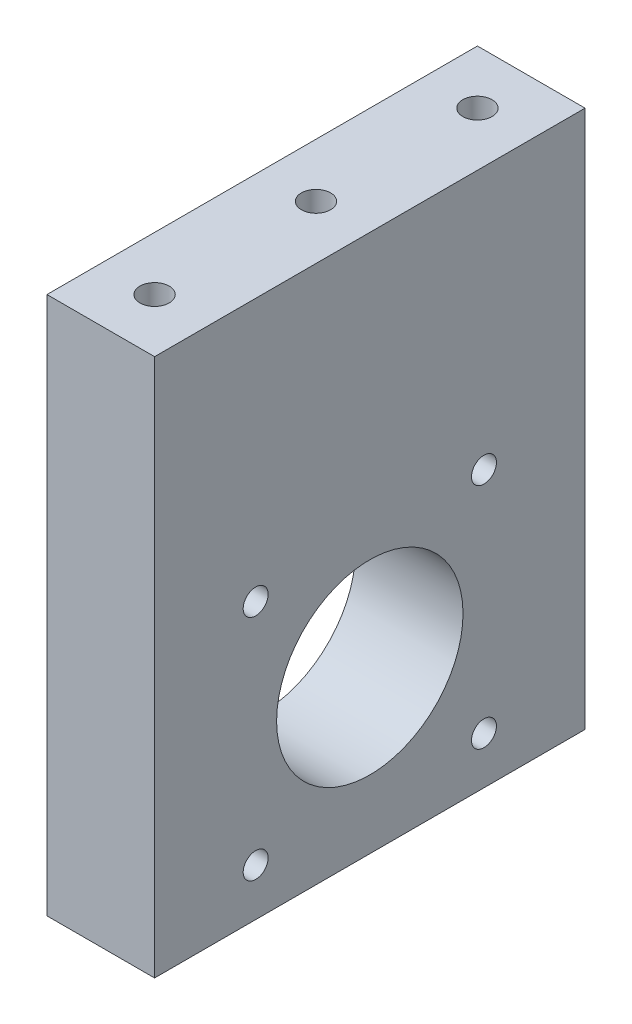
ISO-10303-21;
HEADER;
FILE_DESCRIPTION(('STEP AP214'),'2;1');
FILE_NAME('part.step','',(''),(''),'','','');
FILE_SCHEMA(('AUTOMOTIVE_DESIGN { 1 0 10303 214 1 1 1 1 }'));
ENDSEC;
DATA;
#1=APPLICATION_CONTEXT('core data for automotive mechanical design processes');
#2=APPLICATION_PROTOCOL_DEFINITION('international standard','automotive_design',2000,#1);
#3=PRODUCT_CONTEXT('',#1,'mechanical');
#4=PRODUCT('Part','Part','',(#3));
#5=PRODUCT_RELATED_PRODUCT_CATEGORY('part','',(#4));
#6=PRODUCT_DEFINITION_FORMATION('','',#4);
#7=PRODUCT_DEFINITION_CONTEXT('part definition',#1,'design');
#8=PRODUCT_DEFINITION('design','',#6,#7);
#9=PRODUCT_DEFINITION_SHAPE('','',#8);
#10=(LENGTH_UNIT() NAMED_UNIT(*) SI_UNIT(.MILLI.,.METRE.));
#11=(NAMED_UNIT(*) PLANE_ANGLE_UNIT() SI_UNIT($,.RADIAN.));
#12=(NAMED_UNIT(*) SI_UNIT($,.STERADIAN.) SOLID_ANGLE_UNIT());
#13=UNCERTAINTY_MEASURE_WITH_UNIT(LENGTH_MEASURE(1.E-05),#10,'distance_accuracy_value','');
#14=(GEOMETRIC_REPRESENTATION_CONTEXT(3) GLOBAL_UNCERTAINTY_ASSIGNED_CONTEXT((#13)) GLOBAL_UNIT_ASSIGNED_CONTEXT((#10,
#11,#12)) REPRESENTATION_CONTEXT('',''));
#15=CARTESIAN_POINT('',(0.,0.,0.));
#16=DIRECTION('',(0.,0.,1.));
#17=DIRECTION('',(1.,0.,0.));
#18=AXIS2_PLACEMENT_3D('',#15,#16,#17);
#19=CARTESIAN_POINT('',(12.7,-31.75,-25.4));
#20=DIRECTION('',(0.,0.,1.));
#21=DIRECTION('',(1.,0.,0.));
#22=AXIS2_PLACEMENT_3D('',#19,#20,#21);
#23=PLANE('',#22);
#24=DIRECTION('',(0.,1.,0.));
#25=VECTOR('',#24,1.);
#26=CARTESIAN_POINT('',(0.,-31.75,-25.4));
#27=LINE('',#26,#25);
#28=CARTESIAN_POINT('',(0.,-31.75,-25.4));
#29=VERTEX_POINT('',#28);
#30=CARTESIAN_POINT('',(0.,31.75,-25.4));
#31=VERTEX_POINT('',#30);
#32=EDGE_CURVE('E126',#29,#31,#27,.T.);
#33=ORIENTED_EDGE('',*,*,#32,.T.);
#34=DIRECTION('',(-1.,0.,0.));
#35=VECTOR('',#34,1.);
#36=CARTESIAN_POINT('',(12.7,31.75,-25.4));
#37=LINE('',#36,#35);
#38=CARTESIAN_POINT('',(12.7,31.75,-25.4));
#39=VERTEX_POINT('',#38);
#40=EDGE_CURVE('E11',#39,#31,#37,.T.);
#41=ORIENTED_EDGE('',*,*,#40,.F.);
#42=DIRECTION('',(0.,1.,0.));
#43=VECTOR('',#42,1.);
#44=CARTESIAN_POINT('',(12.7,-31.75,-25.4));
#45=LINE('',#44,#43);
#46=CARTESIAN_POINT('',(12.7,-31.75,-25.4));
#47=VERTEX_POINT('',#46);
#48=EDGE_CURVE('E127',#47,#39,#45,.T.);
#49=ORIENTED_EDGE('',*,*,#48,.F.);
#50=DIRECTION('',(-1.,0.,0.));
#51=VECTOR('',#50,1.);
#52=CARTESIAN_POINT('',(12.7,-31.75,-25.4));
#53=LINE('',#52,#51);
#54=EDGE_CURVE('E133',#47,#29,#53,.T.);
#55=ORIENTED_EDGE('',*,*,#54,.T.);
#56=EDGE_LOOP('',(#33,#41,#49,#55));
#57=FACE_BOUND('',#56,.T.);
#58=ADVANCED_FACE('F34',(#57),#23,.F.);
#59=CARTESIAN_POINT('',(12.7,31.75,25.4));
#60=DIRECTION('',(0.,-1.,0.));
#61=DIRECTION('',(0.,0.,-1.));
#62=AXIS2_PLACEMENT_3D('',#59,#60,#61);
#63=PLANE('',#62);
#64=CARTESIAN_POINT('',(6.35,31.75,-19.05));
#65=DIRECTION('',(0.,1.,0.));
#66=DIRECTION('',(0.,0.,1.));
#67=AXIS2_PLACEMENT_3D('',#64,#65,#66);
#68=CIRCLE('',#67,1.7272);
#69=CARTESIAN_POINT('',(6.35,31.75,-17.3228));
#70=VERTEX_POINT('',#69);
#71=EDGE_CURVE('E102',#70,#70,#68,.T.);
#72=ORIENTED_EDGE('',*,*,#71,.F.);
#73=EDGE_LOOP('',(#72));
#74=FACE_BOUND('',#73,.T.);
#75=CARTESIAN_POINT('',(6.35,31.75,19.05));
#76=DIRECTION('',(0.,1.,0.));
#77=DIRECTION('',(0.,0.,1.));
#78=AXIS2_PLACEMENT_3D('',#75,#76,#77);
#79=CIRCLE('',#78,1.7272);
#80=CARTESIAN_POINT('',(6.35,31.75,20.7772));
#81=VERTEX_POINT('',#80);
#82=EDGE_CURVE('E101',#81,#81,#79,.T.);
#83=ORIENTED_EDGE('',*,*,#82,.F.);
#84=EDGE_LOOP('',(#83));
#85=FACE_BOUND('',#84,.T.);
#86=CARTESIAN_POINT('',(6.35,31.75,0.));
#87=DIRECTION('',(0.,1.,0.));
#88=DIRECTION('',(0.,0.,1.));
#89=AXIS2_PLACEMENT_3D('',#86,#87,#88);
#90=CIRCLE('',#89,1.7272);
#91=CARTESIAN_POINT('',(6.35,31.75,1.7272));
#92=VERTEX_POINT('',#91);
#93=EDGE_CURVE('E114',#92,#92,#90,.T.);
#94=ORIENTED_EDGE('',*,*,#93,.F.);
#95=EDGE_LOOP('',(#94));
#96=FACE_BOUND('',#95,.T.);
#97=DIRECTION('',(0.,0.,1.));
#98=VECTOR('',#97,1.);
#99=CARTESIAN_POINT('',(0.,31.75,25.4));
#100=LINE('',#99,#98);
#101=CARTESIAN_POINT('',(0.,31.75,25.4));
#102=VERTEX_POINT('',#101);
#103=EDGE_CURVE('E136',#31,#102,#100,.T.);
#104=ORIENTED_EDGE('',*,*,#103,.T.);
#105=DIRECTION('',(-1.,0.,0.));
#106=VECTOR('',#105,1.);
#107=CARTESIAN_POINT('',(12.7,31.75,25.4));
#108=LINE('',#107,#106);
#109=CARTESIAN_POINT('',(12.7,31.75,25.4));
#110=VERTEX_POINT('',#109);
#111=EDGE_CURVE('E42',#110,#102,#108,.T.);
#112=ORIENTED_EDGE('',*,*,#111,.F.);
#113=DIRECTION('',(0.,0.,1.));
#114=VECTOR('',#113,1.);
#115=CARTESIAN_POINT('',(12.7,31.75,25.4));
#116=LINE('',#115,#114);
#117=EDGE_CURVE('E81',#39,#110,#116,.T.);
#118=ORIENTED_EDGE('',*,*,#117,.F.);
#119=ORIENTED_EDGE('',*,*,#40,.T.);
#120=EDGE_LOOP('',(#104,#112,#118,#119));
#121=FACE_BOUND('',#120,.T.);
#122=ADVANCED_FACE('F161',(#74,#85,#96,#121),#63,.F.);
#123=CARTESIAN_POINT('',(12.7,-31.75,25.4));
#124=DIRECTION('',(0.,0.,-1.));
#125=DIRECTION('',(-1.,0.,0.));
#126=AXIS2_PLACEMENT_3D('',#123,#124,#125);
#127=PLANE('',#126);
#128=DIRECTION('',(0.,-1.,0.));
#129=VECTOR('',#128,1.);
#130=CARTESIAN_POINT('',(0.,-31.75,25.4));
#131=LINE('',#130,#129);
#132=CARTESIAN_POINT('',(0.,-31.75,25.4));
#133=VERTEX_POINT('',#132);
#134=EDGE_CURVE('E68',#102,#133,#131,.T.);
#135=ORIENTED_EDGE('',*,*,#134,.T.);
#136=DIRECTION('',(-1.,0.,0.));
#137=VECTOR('',#136,1.);
#138=CARTESIAN_POINT('',(12.7,-31.75,25.4));
#139=LINE('',#138,#137);
#140=CARTESIAN_POINT('',(12.7,-31.75,25.4));
#141=VERTEX_POINT('',#140);
#142=EDGE_CURVE('E141',#141,#133,#139,.T.);
#143=ORIENTED_EDGE('',*,*,#142,.F.);
#144=DIRECTION('',(0.,-1.,0.));
#145=VECTOR('',#144,1.);
#146=CARTESIAN_POINT('',(12.7,-31.75,25.4));
#147=LINE('',#146,#145);
#148=EDGE_CURVE('E130',#110,#141,#147,.T.);
#149=ORIENTED_EDGE('',*,*,#148,.F.);
#150=ORIENTED_EDGE('',*,*,#111,.T.);
#151=EDGE_LOOP('',(#135,#143,#149,#150));
#152=FACE_BOUND('',#151,.T.);
#153=ADVANCED_FACE('F143',(#152),#127,.F.);
#154=CARTESIAN_POINT('',(12.7,-31.75,25.4));
#155=DIRECTION('',(0.,1.,0.));
#156=DIRECTION('',(0.,0.,1.));
#157=AXIS2_PLACEMENT_3D('',#154,#155,#156);
#158=PLANE('',#157);
#159=DIRECTION('',(0.,0.,-1.));
#160=VECTOR('',#159,1.);
#161=CARTESIAN_POINT('',(0.,-31.75,25.4));
#162=LINE('',#161,#160);
#163=EDGE_CURVE('E74',#133,#29,#162,.T.);
#164=ORIENTED_EDGE('',*,*,#163,.T.);
#165=ORIENTED_EDGE('',*,*,#54,.F.);
#166=DIRECTION('',(0.,0.,-1.));
#167=VECTOR('',#166,1.);
#168=CARTESIAN_POINT('',(12.7,-31.75,25.4));
#169=LINE('',#168,#167);
#170=EDGE_CURVE('E50',#141,#47,#169,.T.);
#171=ORIENTED_EDGE('',*,*,#170,.F.);
#172=ORIENTED_EDGE('',*,*,#142,.T.);
#173=EDGE_LOOP('',(#164,#165,#171,#172));
#174=FACE_BOUND('',#173,.T.);
#175=ADVANCED_FACE('F150',(#174),#158,.F.);
#176=CARTESIAN_POINT('',(12.7,0.,0.));
#177=DIRECTION('',(-1.,0.,0.));
#178=DIRECTION('',(0.,0.,1.));
#179=AXIS2_PLACEMENT_3D('',#176,#177,#178);
#180=PLANE('',#179);
#181=CARTESIAN_POINT('',(12.7,-26.1703841816035,-13.4703841816039));
#182=DIRECTION('',(-1.,0.,0.));
#183=DIRECTION('',(0.,0.,1.));
#184=AXIS2_PLACEMENT_3D('',#181,#182,#183);
#185=CIRCLE('',#184,1.4732);
#186=CARTESIAN_POINT('',(12.7,-26.1703841816035,-11.9971841816039));
#187=VERTEX_POINT('',#186);
#188=EDGE_CURVE('E236',#187,#187,#185,.T.);
#189=ORIENTED_EDGE('',*,*,#188,.T.);
#190=EDGE_LOOP('',(#189));
#191=FACE_BOUND('',#190,.T.);
#192=CARTESIAN_POINT('',(12.7,-26.1703841816038,13.4703841816037));
#193=DIRECTION('',(-1.,0.,0.));
#194=DIRECTION('',(0.,0.,1.));
#195=AXIS2_PLACEMENT_3D('',#192,#193,#194);
#196=CIRCLE('',#195,1.4732);
#197=CARTESIAN_POINT('',(12.7,-26.1703841816038,14.9435841816037));
#198=VERTEX_POINT('',#197);
#199=EDGE_CURVE('E232',#198,#198,#196,.T.);
#200=ORIENTED_EDGE('',*,*,#199,.T.);
#201=EDGE_LOOP('',(#200));
#202=FACE_BOUND('',#201,.T.);
#203=CARTESIAN_POINT('',(12.7,0.770384181603601,13.4703841816038));
#204=DIRECTION('',(-1.,0.,0.));
#205=DIRECTION('',(0.,0.,1.));
#206=AXIS2_PLACEMENT_3D('',#203,#204,#205);
#207=CIRCLE('',#206,1.4732);
#208=CARTESIAN_POINT('',(12.7,0.770384181603601,14.9435841816038));
#209=VERTEX_POINT('',#208);
#210=EDGE_CURVE('E225',#209,#209,#207,.T.);
#211=ORIENTED_EDGE('',*,*,#210,.T.);
#212=EDGE_LOOP('',(#211));
#213=FACE_BOUND('',#212,.T.);
#214=CARTESIAN_POINT('',(12.7,0.77038418160379,-13.4703841816037));
#215=DIRECTION('',(-1.,0.,0.));
#216=DIRECTION('',(0.,0.,1.));
#217=AXIS2_PLACEMENT_3D('',#214,#215,#216);
#218=CIRCLE('',#217,1.4732);
#219=CARTESIAN_POINT('',(12.7,0.77038418160379,-11.9971841816037));
#220=VERTEX_POINT('',#219);
#221=EDGE_CURVE('E108',#220,#220,#218,.T.);
#222=ORIENTED_EDGE('',*,*,#221,.T.);
#223=EDGE_LOOP('',(#222));
#224=FACE_BOUND('',#223,.T.);
#225=CARTESIAN_POINT('',(12.7,-12.7,0.));
#226=DIRECTION('',(1.,0.,0.));
#227=DIRECTION('',(0.,0.,-1.));
#228=AXIS2_PLACEMENT_3D('',#225,#226,#227);
#229=CIRCLE('',#228,11.);
#230=CARTESIAN_POINT('',(12.7,-12.7,-11.));
#231=VERTEX_POINT('',#230);
#232=EDGE_CURVE('E120',#231,#231,#229,.T.);
#233=ORIENTED_EDGE('',*,*,#232,.F.);
#234=EDGE_LOOP('',(#233));
#235=FACE_BOUND('',#234,.T.);
#236=ORIENTED_EDGE('',*,*,#48,.T.);
#237=ORIENTED_EDGE('',*,*,#117,.T.);
#238=ORIENTED_EDGE('',*,*,#148,.T.);
#239=ORIENTED_EDGE('',*,*,#170,.T.);
#240=EDGE_LOOP('',(#236,#237,#238,#239));
#241=FACE_BOUND('',#240,.T.);
#242=ADVANCED_FACE('F152',(#191,#202,#213,#224,#235,#241),#180,.F.);
#243=CARTESIAN_POINT('',(0.,0.,0.));
#244=DIRECTION('',(-1.,0.,0.));
#245=DIRECTION('',(0.,0.,1.));
#246=AXIS2_PLACEMENT_3D('',#243,#244,#245);
#247=PLANE('',#246);
#248=CARTESIAN_POINT('',(0.,-26.1703841816035,-13.4703841816039));
#249=DIRECTION('',(-1.,0.,0.));
#250=DIRECTION('',(0.,0.,1.));
#251=AXIS2_PLACEMENT_3D('',#248,#249,#250);
#252=CIRCLE('',#251,1.47319999999999);
#253=CARTESIAN_POINT('',(0.,-26.1703841816035,-11.997184181604));
#254=VERTEX_POINT('',#253);
#255=EDGE_CURVE('E207',#254,#254,#252,.T.);
#256=ORIENTED_EDGE('',*,*,#255,.F.);
#257=EDGE_LOOP('',(#256));
#258=FACE_BOUND('',#257,.T.);
#259=CARTESIAN_POINT('',(0.,-26.1703841816038,13.4703841816037));
#260=DIRECTION('',(-1.,0.,0.));
#261=DIRECTION('',(0.,0.,1.));
#262=AXIS2_PLACEMENT_3D('',#259,#260,#261);
#263=CIRCLE('',#262,1.47319999999999);
#264=CARTESIAN_POINT('',(0.,-26.1703841816038,14.9435841816036));
#265=VERTEX_POINT('',#264);
#266=EDGE_CURVE('E211',#265,#265,#263,.T.);
#267=ORIENTED_EDGE('',*,*,#266,.F.);
#268=EDGE_LOOP('',(#267));
#269=FACE_BOUND('',#268,.T.);
#270=CARTESIAN_POINT('',(0.,0.770384181603601,13.4703841816038));
#271=DIRECTION('',(-1.,0.,0.));
#272=DIRECTION('',(0.,0.,1.));
#273=AXIS2_PLACEMENT_3D('',#270,#271,#272);
#274=CIRCLE('',#273,1.47319999999999);
#275=CARTESIAN_POINT('',(0.,0.770384181603601,14.9435841816038));
#276=VERTEX_POINT('',#275);
#277=EDGE_CURVE('E215',#276,#276,#274,.T.);
#278=ORIENTED_EDGE('',*,*,#277,.F.);
#279=EDGE_LOOP('',(#278));
#280=FACE_BOUND('',#279,.T.);
#281=CARTESIAN_POINT('',(0.,0.77038418160379,-13.4703841816037));
#282=DIRECTION('',(-1.,0.,0.));
#283=DIRECTION('',(0.,0.,1.));
#284=AXIS2_PLACEMENT_3D('',#281,#282,#283);
#285=CIRCLE('',#284,1.47319999999999);
#286=CARTESIAN_POINT('',(0.,0.77038418160379,-11.9971841816037));
#287=VERTEX_POINT('',#286);
#288=EDGE_CURVE('E219',#287,#287,#285,.T.);
#289=ORIENTED_EDGE('',*,*,#288,.F.);
#290=EDGE_LOOP('',(#289));
#291=FACE_BOUND('',#290,.T.);
#292=CARTESIAN_POINT('',(0.,-12.7,0.));
#293=DIRECTION('',(1.,0.,0.));
#294=DIRECTION('',(0.,0.,-1.));
#295=AXIS2_PLACEMENT_3D('',#292,#293,#294);
#296=CIRCLE('',#295,11.);
#297=CARTESIAN_POINT('',(0.,-12.7,-11.));
#298=VERTEX_POINT('',#297);
#299=EDGE_CURVE('E123',#298,#298,#296,.T.);
#300=ORIENTED_EDGE('',*,*,#299,.T.);
#301=EDGE_LOOP('',(#300));
#302=FACE_BOUND('',#301,.T.);
#303=ORIENTED_EDGE('',*,*,#32,.F.);
#304=ORIENTED_EDGE('',*,*,#163,.F.);
#305=ORIENTED_EDGE('',*,*,#134,.F.);
#306=ORIENTED_EDGE('',*,*,#103,.F.);
#307=EDGE_LOOP('',(#303,#304,#305,#306));
#308=FACE_BOUND('',#307,.T.);
#309=ADVANCED_FACE('F146',(#258,#269,#280,#291,#302,#308),#247,.T.);
#310=CARTESIAN_POINT('',(12.7,-12.7,0.));
#311=DIRECTION('',(1.,0.,0.));
#312=DIRECTION('',(0.,0.,-1.));
#313=AXIS2_PLACEMENT_3D('',#310,#311,#312);
#314=CYLINDRICAL_SURFACE('',#313,11.);
#315=ORIENTED_EDGE('',*,*,#299,.F.);
#316=EDGE_LOOP('',(#315));
#317=FACE_BOUND('',#316,.T.);
#318=ORIENTED_EDGE('',*,*,#232,.T.);
#319=EDGE_LOOP('',(#318));
#320=FACE_BOUND('',#319,.T.);
#321=ADVANCED_FACE('F191',(#317,#320),#314,.F.);
#322=CARTESIAN_POINT('',(6.35,21.082,0.));
#323=DIRECTION('',(0.,1.,0.));
#324=DIRECTION('',(0.,0.,1.));
#325=AXIS2_PLACEMENT_3D('',#322,#323,#324);
#326=CONICAL_SURFACE('',#325,1.7272,1.02974425867665);
#327=CARTESIAN_POINT('',(6.35,20.0441935388156,0.));
#328=VERTEX_POINT('',#327);
#329=VERTEX_LOOP('',#328);
#330=FACE_BOUND('',#329,.T.);
#331=CARTESIAN_POINT('',(6.35,21.082,0.));
#332=DIRECTION('',(0.,1.,0.));
#333=DIRECTION('',(0.,0.,1.));
#334=AXIS2_PLACEMENT_3D('',#331,#332,#333);
#335=CIRCLE('',#334,1.7272);
#336=CARTESIAN_POINT('',(6.35,21.082,1.7272));
#337=VERTEX_POINT('',#336);
#338=EDGE_CURVE('E117',#337,#337,#335,.T.);
#339=ORIENTED_EDGE('',*,*,#338,.T.);
#340=EDGE_LOOP('',(#339));
#341=FACE_BOUND('',#340,.T.);
#342=ADVANCED_FACE('F182',(#330,#341),#326,.F.);
#343=CARTESIAN_POINT('',(6.35,31.75,0.));
#344=DIRECTION('',(0.,1.,0.));
#345=DIRECTION('',(0.,0.,1.));
#346=AXIS2_PLACEMENT_3D('',#343,#344,#345);
#347=CYLINDRICAL_SURFACE('',#346,1.7272);
#348=ORIENTED_EDGE('',*,*,#338,.F.);
#349=EDGE_LOOP('',(#348));
#350=FACE_BOUND('',#349,.T.);
#351=ORIENTED_EDGE('',*,*,#93,.T.);
#352=EDGE_LOOP('',(#351));
#353=FACE_BOUND('',#352,.T.);
#354=ADVANCED_FACE('F179',(#350,#353),#347,.F.);
#355=CARTESIAN_POINT('',(6.35,21.082,19.05));
#356=DIRECTION('',(0.,1.,0.));
#357=DIRECTION('',(0.,0.,1.));
#358=AXIS2_PLACEMENT_3D('',#355,#356,#357);
#359=CONICAL_SURFACE('',#358,1.7272,1.02974425867665);
#360=CARTESIAN_POINT('',(6.35,20.0441935388156,19.05));
#361=VERTEX_POINT('',#360);
#362=VERTEX_LOOP('',#361);
#363=FACE_BOUND('',#362,.T.);
#364=CARTESIAN_POINT('',(6.35,21.082,19.05));
#365=DIRECTION('',(0.,1.,0.));
#366=DIRECTION('',(0.,0.,1.));
#367=AXIS2_PLACEMENT_3D('',#364,#365,#366);
#368=CIRCLE('',#367,1.7272);
#369=CARTESIAN_POINT('',(6.35,21.082,20.7772));
#370=VERTEX_POINT('',#369);
#371=EDGE_CURVE('E105',#370,#370,#368,.T.);
#372=ORIENTED_EDGE('',*,*,#371,.T.);
#373=EDGE_LOOP('',(#372));
#374=FACE_BOUND('',#373,.T.);
#375=ADVANCED_FACE('F181',(#363,#374),#359,.F.);
#376=CARTESIAN_POINT('',(6.35,31.75,19.05));
#377=DIRECTION('',(0.,1.,0.));
#378=DIRECTION('',(0.,0.,1.));
#379=AXIS2_PLACEMENT_3D('',#376,#377,#378);
#380=CYLINDRICAL_SURFACE('',#379,1.7272);
#381=ORIENTED_EDGE('',*,*,#371,.F.);
#382=EDGE_LOOP('',(#381));
#383=FACE_BOUND('',#382,.T.);
#384=ORIENTED_EDGE('',*,*,#82,.T.);
#385=EDGE_LOOP('',(#384));
#386=FACE_BOUND('',#385,.T.);
#387=ADVANCED_FACE('F95',(#383,#386),#380,.F.);
#388=CARTESIAN_POINT('',(6.35,21.082,-19.05));
#389=DIRECTION('',(0.,1.,0.));
#390=DIRECTION('',(0.,0.,1.));
#391=AXIS2_PLACEMENT_3D('',#388,#389,#390);
#392=CONICAL_SURFACE('',#391,1.7272,1.02974425867665);
#393=CARTESIAN_POINT('',(6.35,20.0441935388156,-19.05));
#394=VERTEX_POINT('',#393);
#395=VERTEX_LOOP('',#394);
#396=FACE_BOUND('',#395,.T.);
#397=CARTESIAN_POINT('',(6.35,21.082,-19.05));
#398=DIRECTION('',(0.,1.,0.));
#399=DIRECTION('',(0.,0.,1.));
#400=AXIS2_PLACEMENT_3D('',#397,#398,#399);
#401=CIRCLE('',#400,1.7272);
#402=CARTESIAN_POINT('',(6.35,21.082,-17.3228));
#403=VERTEX_POINT('',#402);
#404=EDGE_CURVE('E99',#403,#403,#401,.T.);
#405=ORIENTED_EDGE('',*,*,#404,.T.);
#406=EDGE_LOOP('',(#405));
#407=FACE_BOUND('',#406,.T.);
#408=ADVANCED_FACE('F91',(#396,#407),#392,.F.);
#409=CARTESIAN_POINT('',(6.35,31.75,-19.05));
#410=DIRECTION('',(0.,1.,0.));
#411=DIRECTION('',(0.,0.,1.));
#412=AXIS2_PLACEMENT_3D('',#409,#410,#411);
#413=CYLINDRICAL_SURFACE('',#412,1.7272);
#414=ORIENTED_EDGE('',*,*,#404,.F.);
#415=EDGE_LOOP('',(#414));
#416=FACE_BOUND('',#415,.T.);
#417=ORIENTED_EDGE('',*,*,#71,.T.);
#418=EDGE_LOOP('',(#417));
#419=FACE_BOUND('',#418,.T.);
#420=ADVANCED_FACE('F94',(#416,#419),#413,.F.);
#421=CARTESIAN_POINT('',(0.,0.77038418160379,-13.4703841816037));
#422=DIRECTION('',(-1.,0.,0.));
#423=DIRECTION('',(0.,0.,1.));
#424=AXIS2_PLACEMENT_3D('',#421,#422,#423);
#425=CYLINDRICAL_SURFACE('',#424,1.47319999999999);
#426=ORIENTED_EDGE('',*,*,#221,.F.);
#427=EDGE_LOOP('',(#426));
#428=FACE_BOUND('',#427,.T.);
#429=ORIENTED_EDGE('',*,*,#288,.T.);
#430=EDGE_LOOP('',(#429));
#431=FACE_BOUND('',#430,.T.);
#432=ADVANCED_FACE('F255',(#428,#431),#425,.F.);
#433=CARTESIAN_POINT('',(0.,0.770384181603601,13.4703841816038));
#434=DIRECTION('',(-1.,0.,0.));
#435=DIRECTION('',(0.,0.,1.));
#436=AXIS2_PLACEMENT_3D('',#433,#434,#435);
#437=CYLINDRICAL_SURFACE('',#436,1.47319999999999);
#438=ORIENTED_EDGE('',*,*,#210,.F.);
#439=EDGE_LOOP('',(#438));
#440=FACE_BOUND('',#439,.T.);
#441=ORIENTED_EDGE('',*,*,#277,.T.);
#442=EDGE_LOOP('',(#441));
#443=FACE_BOUND('',#442,.T.);
#444=ADVANCED_FACE('F248',(#440,#443),#437,.F.);
#445=CARTESIAN_POINT('',(0.,-26.1703841816038,13.4703841816037));
#446=DIRECTION('',(-1.,0.,0.));
#447=DIRECTION('',(0.,0.,1.));
#448=AXIS2_PLACEMENT_3D('',#445,#446,#447);
#449=CYLINDRICAL_SURFACE('',#448,1.47319999999999);
#450=ORIENTED_EDGE('',*,*,#199,.F.);
#451=EDGE_LOOP('',(#450));
#452=FACE_BOUND('',#451,.T.);
#453=ORIENTED_EDGE('',*,*,#266,.T.);
#454=EDGE_LOOP('',(#453));
#455=FACE_BOUND('',#454,.T.);
#456=ADVANCED_FACE('F242',(#452,#455),#449,.F.);
#457=CARTESIAN_POINT('',(0.,-26.1703841816035,-13.4703841816039));
#458=DIRECTION('',(-1.,0.,0.));
#459=DIRECTION('',(0.,0.,1.));
#460=AXIS2_PLACEMENT_3D('',#457,#458,#459);
#461=CYLINDRICAL_SURFACE('',#460,1.47319999999999);
#462=ORIENTED_EDGE('',*,*,#188,.F.);
#463=EDGE_LOOP('',(#462));
#464=FACE_BOUND('',#463,.T.);
#465=ORIENTED_EDGE('',*,*,#255,.T.);
#466=EDGE_LOOP('',(#465));
#467=FACE_BOUND('',#466,.T.);
#468=ADVANCED_FACE('F240',(#464,#467),#461,.F.);
#469=CLOSED_SHELL('',(#58,#122,#153,#175,#242,#309,#321,#342,#354,#375,#387,#408,#420,#432,#444,
#456,#468));
#470=MANIFOLD_SOLID_BREP('B2',#469);
#471=ADVANCED_BREP_SHAPE_REPRESENTATION('',(#18,#470),#14);
#472=SHAPE_DEFINITION_REPRESENTATION(#9,#471);
ENDSEC;
END-ISO-10303-21;
